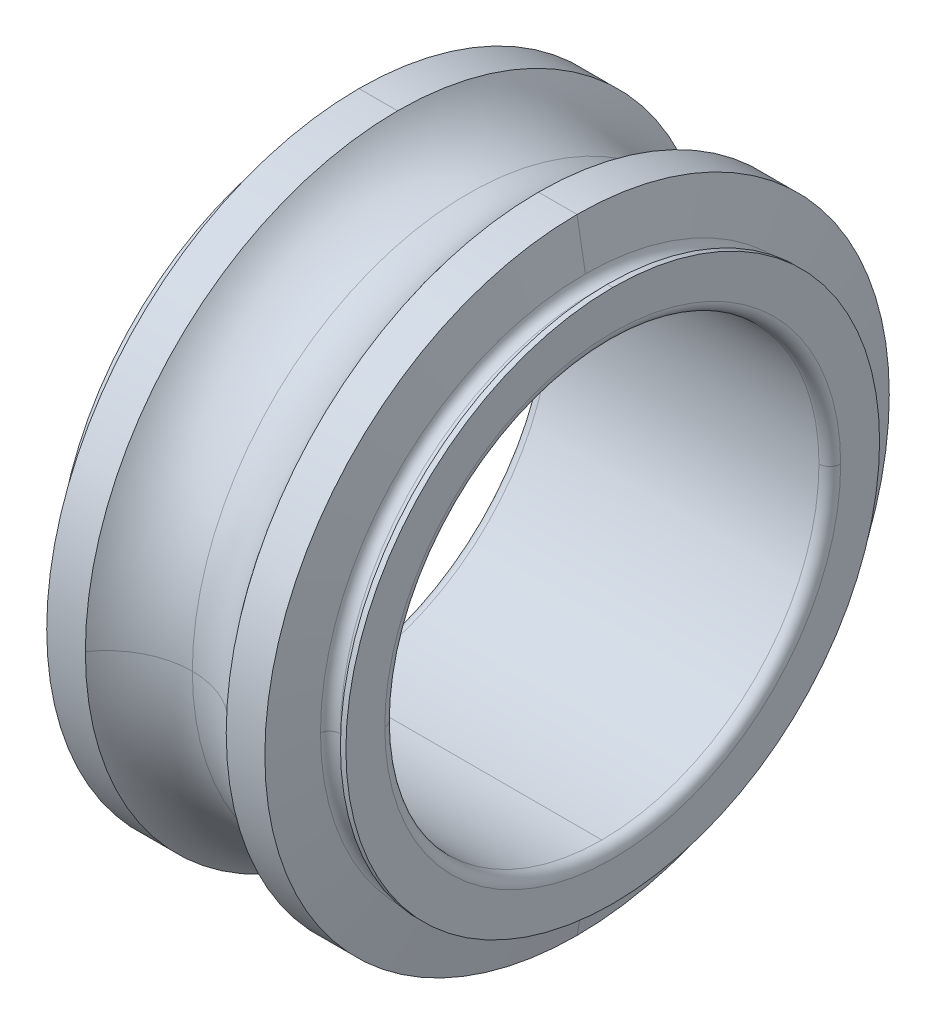
ISO-10303-21;
HEADER;
FILE_DESCRIPTION(('STEP AP214'),'2;1');
FILE_NAME('part.step','',(''),(''),'','','');
FILE_SCHEMA(('AUTOMOTIVE_DESIGN { 1 0 10303 214 1 1 1 1 }'));
ENDSEC;
DATA;
#1=APPLICATION_CONTEXT('core data for automotive mechanical design processes');
#2=APPLICATION_PROTOCOL_DEFINITION('international standard','automotive_design',2000,#1);
#3=PRODUCT_CONTEXT('',#1,'mechanical');
#4=PRODUCT('Part','Part','',(#3));
#5=PRODUCT_RELATED_PRODUCT_CATEGORY('part','',(#4));
#6=PRODUCT_DEFINITION_FORMATION('','',#4);
#7=PRODUCT_DEFINITION_CONTEXT('part definition',#1,'design');
#8=PRODUCT_DEFINITION('design','',#6,#7);
#9=PRODUCT_DEFINITION_SHAPE('','',#8);
#10=(LENGTH_UNIT() NAMED_UNIT(*) SI_UNIT(.MILLI.,.METRE.));
#11=(NAMED_UNIT(*) PLANE_ANGLE_UNIT() SI_UNIT($,.RADIAN.));
#12=(NAMED_UNIT(*) SI_UNIT($,.STERADIAN.) SOLID_ANGLE_UNIT());
#13=UNCERTAINTY_MEASURE_WITH_UNIT(LENGTH_MEASURE(1.E-05),#10,'distance_accuracy_value','');
#14=(GEOMETRIC_REPRESENTATION_CONTEXT(3) GLOBAL_UNCERTAINTY_ASSIGNED_CONTEXT((#13)) GLOBAL_UNIT_ASSIGNED_CONTEXT((#10,
#11,#12)) REPRESENTATION_CONTEXT('',''));
#15=CARTESIAN_POINT('',(0.,0.,0.));
#16=DIRECTION('',(0.,0.,1.));
#17=DIRECTION('',(1.,0.,0.));
#18=AXIS2_PLACEMENT_3D('',#15,#16,#17);
#19=CARTESIAN_POINT('',(6.48036660683857,0.,0.));
#20=DIRECTION('',(1.,0.,0.));
#21=DIRECTION('',(0.,1.,0.));
#22=AXIS2_PLACEMENT_3D('',#19,#20,#21);
#23=CYLINDRICAL_SURFACE('',#22,8.62875);
#24=DIRECTION('',(1.,0.,0.));
#25=VECTOR('',#24,1.);
#26=CARTESIAN_POINT('',(6.48036660683857,8.62875,0.));
#27=LINE('',#26,#25);
#28=CARTESIAN_POINT('',(5.94649285575365,8.62875,0.));
#29=VERTEX_POINT('',#28);
#30=CARTESIAN_POINT('',(7.0142403579235,8.62875,0.));
#31=VERTEX_POINT('',#30);
#32=EDGE_CURVE('E318',#29,#31,#27,.T.);
#33=ORIENTED_EDGE('',*,*,#32,.T.);
#34=CARTESIAN_POINT('',(7.0142403579235,0.,0.));
#35=DIRECTION('',(1.,0.,0.));
#36=DIRECTION('',(0.,1.,0.));
#37=AXIS2_PLACEMENT_3D('',#34,#35,#36);
#38=CIRCLE('',#37,8.62875);
#39=CARTESIAN_POINT('',(7.0142403579235,-8.62875,0.));
#40=VERTEX_POINT('',#39);
#41=EDGE_CURVE('E281',#40,#31,#38,.T.);
#42=ORIENTED_EDGE('',*,*,#41,.F.);
#43=DIRECTION('',(-1.,0.,0.));
#44=VECTOR('',#43,1.);
#45=CARTESIAN_POINT('',(6.48036660683857,-8.62875,0.));
#46=LINE('',#45,#44);
#47=CARTESIAN_POINT('',(5.94649285575364,-8.62875,0.));
#48=VERTEX_POINT('',#47);
#49=EDGE_CURVE('E322',#40,#48,#46,.T.);
#50=ORIENTED_EDGE('',*,*,#49,.T.);
#51=CARTESIAN_POINT('',(5.94649285575365,0.,0.));
#52=DIRECTION('',(1.,0.,0.));
#53=DIRECTION('',(0.,1.,0.));
#54=AXIS2_PLACEMENT_3D('',#51,#52,#53);
#55=CIRCLE('',#54,8.62875);
#56=CARTESIAN_POINT('',(5.94649285575364,0.,-8.62875));
#57=VERTEX_POINT('',#56);
#58=EDGE_CURVE('E205',#48,#57,#55,.T.);
#59=ORIENTED_EDGE('',*,*,#58,.T.);
#60=CARTESIAN_POINT('',(5.94649285575365,0.,0.));
#61=DIRECTION('',(1.,0.,0.));
#62=DIRECTION('',(0.,1.,0.));
#63=AXIS2_PLACEMENT_3D('',#60,#61,#62);
#64=CIRCLE('',#63,8.62875);
#65=EDGE_CURVE('E243',#57,#29,#64,.T.);
#66=ORIENTED_EDGE('',*,*,#65,.T.);
#67=EDGE_LOOP('',(#33,#42,#50,#59,#66));
#68=FACE_BOUND('',#67,.T.);
#69=ADVANCED_FACE('F17',(#68),#23,.T.);
#70=CARTESIAN_POINT('',(4.,0.,0.));
#71=DIRECTION('',(1.,0.,0.));
#72=DIRECTION('',(0.,0.,-1.));
#73=AXIS2_PLACEMENT_3D('',#70,#71,#72);
#74=TOROIDAL_SURFACE('',#73,10.,2.381);
#75=CARTESIAN_POINT('',(4.,0.,0.));
#76=DIRECTION('',(-1.,0.,0.));
#77=DIRECTION('',(0.,0.,1.));
#78=AXIS2_PLACEMENT_3D('',#75,#76,#77);
#79=CIRCLE('',#78,7.619);
#80=CARTESIAN_POINT('',(4.,0.,7.619));
#81=VERTEX_POINT('',#80);
#82=CARTESIAN_POINT('',(4.,0.,-7.619));
#83=VERTEX_POINT('',#82);
#84=EDGE_CURVE('E187',#81,#83,#79,.T.);
#85=ORIENTED_EDGE('',*,*,#84,.T.);
#86=CARTESIAN_POINT('',(4.,0.,-10.));
#87=DIRECTION('',(0.,-1.,0.));
#88=DIRECTION('',(0.,0.,-1.));
#89=AXIS2_PLACEMENT_3D('',#86,#87,#88);
#90=CIRCLE('',#89,2.381);
#91=CARTESIAN_POINT('',(2.05350714424635,0.,-8.62875));
#92=VERTEX_POINT('',#91);
#93=EDGE_CURVE('E201',#83,#92,#90,.T.);
#94=ORIENTED_EDGE('',*,*,#93,.T.);
#95=CARTESIAN_POINT('',(2.05350714424635,0.,0.));
#96=DIRECTION('',(1.,0.,0.));
#97=DIRECTION('',(0.,1.,0.));
#98=AXIS2_PLACEMENT_3D('',#95,#96,#97);
#99=CIRCLE('',#98,8.62875);
#100=CARTESIAN_POINT('',(2.05350714424635,8.62875,0.));
#101=VERTEX_POINT('',#100);
#102=EDGE_CURVE('E11',#92,#101,#99,.T.);
#103=ORIENTED_EDGE('',*,*,#102,.T.);
#104=CARTESIAN_POINT('',(2.05350714424635,0.,0.));
#105=DIRECTION('',(1.,0.,0.));
#106=DIRECTION('',(0.,1.,0.));
#107=AXIS2_PLACEMENT_3D('',#104,#105,#106);
#108=CIRCLE('',#107,8.62875);
#109=CARTESIAN_POINT('',(2.05350714424635,0.,8.62875));
#110=VERTEX_POINT('',#109);
#111=EDGE_CURVE('E189',#101,#110,#108,.T.);
#112=ORIENTED_EDGE('',*,*,#111,.T.);
#113=CARTESIAN_POINT('',(4.,0.,10.));
#114=DIRECTION('',(0.,-1.,0.));
#115=DIRECTION('',(0.,0.,1.));
#116=AXIS2_PLACEMENT_3D('',#113,#114,#115);
#117=CIRCLE('',#116,2.381);
#118=EDGE_CURVE('E182',#110,#81,#117,.T.);
#119=ORIENTED_EDGE('',*,*,#118,.T.);
#120=EDGE_LOOP('',(#85,#94,#103,#112,#119));
#121=FACE_BOUND('',#120,.T.);
#122=ADVANCED_FACE('F184',(#121),#74,.F.);
#123=CARTESIAN_POINT('',(1.51963339316143,0.,0.));
#124=DIRECTION('',(1.,0.,0.));
#125=DIRECTION('',(0.,1.,0.));
#126=AXIS2_PLACEMENT_3D('',#123,#124,#125);
#127=CYLINDRICAL_SURFACE('',#126,8.62875);
#128=DIRECTION('',(1.,0.,0.));
#129=VECTOR('',#128,1.);
#130=CARTESIAN_POINT('',(1.51963339316143,8.62875,0.));
#131=LINE('',#130,#129);
#132=CARTESIAN_POINT('',(0.985759642076504,8.62875,0.));
#133=VERTEX_POINT('',#132);
#134=EDGE_CURVE('E241',#133,#101,#131,.T.);
#135=ORIENTED_EDGE('',*,*,#134,.T.);
#136=ORIENTED_EDGE('',*,*,#102,.F.);
#137=CARTESIAN_POINT('',(2.05350714424635,0.,0.));
#138=DIRECTION('',(1.,0.,0.));
#139=DIRECTION('',(0.,1.,0.));
#140=AXIS2_PLACEMENT_3D('',#137,#138,#139);
#141=CIRCLE('',#140,8.62875);
#142=CARTESIAN_POINT('',(2.05350714424635,-8.62875,0.));
#143=VERTEX_POINT('',#142);
#144=EDGE_CURVE('E333',#143,#92,#141,.T.);
#145=ORIENTED_EDGE('',*,*,#144,.F.);
#146=DIRECTION('',(-1.,0.,0.));
#147=VECTOR('',#146,1.);
#148=CARTESIAN_POINT('',(1.51963339316143,-8.62875,0.));
#149=LINE('',#148,#147);
#150=CARTESIAN_POINT('',(0.985759642076505,-8.62875,0.));
#151=VERTEX_POINT('',#150);
#152=EDGE_CURVE('E240',#143,#151,#149,.T.);
#153=ORIENTED_EDGE('',*,*,#152,.T.);
#154=CARTESIAN_POINT('',(0.985759642076505,0.,0.));
#155=DIRECTION('',(1.,0.,0.));
#156=DIRECTION('',(0.,1.,0.));
#157=AXIS2_PLACEMENT_3D('',#154,#155,#156);
#158=CIRCLE('',#157,8.62875);
#159=EDGE_CURVE('E20',#151,#133,#158,.T.);
#160=ORIENTED_EDGE('',*,*,#159,.T.);
#161=EDGE_LOOP('',(#135,#136,#145,#153,#160));
#162=FACE_BOUND('',#161,.T.);
#163=ADVANCED_FACE('F407',(#162),#127,.T.);
#164=CARTESIAN_POINT('',(0.870570599496108,0.,0.));
#165=DIRECTION('',(1.,0.,0.));
#166=DIRECTION('',(0.,1.,0.));
#167=AXIS2_PLACEMENT_3D('',#164,#165,#166);
#168=CONICAL_SURFACE('',#167,7.97548047699463,1.39626340159546);
#169=DIRECTION('',(0.17364817766693,0.984807753012208,0.));
#170=VECTOR('',#169,1.);
#171=CARTESIAN_POINT('',(0.870570599496108,7.97548047699463,0.));
#172=LINE('',#171,#170);
#173=CARTESIAN_POINT('',(0.755381556915711,7.32221095398925,0.));
#174=VERTEX_POINT('',#173);
#175=EDGE_CURVE('E339',#174,#133,#172,.T.);
#176=ORIENTED_EDGE('',*,*,#175,.T.);
#177=ORIENTED_EDGE('',*,*,#159,.F.);
#178=DIRECTION('',(-0.17364817766693,0.984807753012208,0.));
#179=VECTOR('',#178,1.);
#180=CARTESIAN_POINT('',(0.870570599496108,-7.97548047699463,0.));
#181=LINE('',#180,#179);
#182=CARTESIAN_POINT('',(0.755381556915711,-7.32221095398925,0.));
#183=VERTEX_POINT('',#182);
#184=EDGE_CURVE('E342',#151,#183,#181,.T.);
#185=ORIENTED_EDGE('',*,*,#184,.T.);
#186=CARTESIAN_POINT('',(0.755381556915711,0.,0.));
#187=DIRECTION('',(1.,0.,0.));
#188=DIRECTION('',(0.,1.,0.));
#189=AXIS2_PLACEMENT_3D('',#186,#187,#188);
#190=CIRCLE('',#189,7.32221095398925);
#191=CARTESIAN_POINT('',(0.755381556915711,0.,-7.32221095398925));
#192=VERTEX_POINT('',#191);
#193=EDGE_CURVE('E295',#183,#192,#190,.T.);
#194=ORIENTED_EDGE('',*,*,#193,.T.);
#195=CARTESIAN_POINT('',(0.755381556915711,0.,0.));
#196=DIRECTION('',(1.,0.,0.));
#197=DIRECTION('',(0.,1.,0.));
#198=AXIS2_PLACEMENT_3D('',#195,#196,#197);
#199=CIRCLE('',#198,7.32221095398925);
#200=EDGE_CURVE('E267',#192,#174,#199,.T.);
#201=ORIENTED_EDGE('',*,*,#200,.T.);
#202=EDGE_LOOP('',(#176,#177,#185,#194,#201));
#203=FACE_BOUND('',#202,.T.);
#204=ADVANCED_FACE('F413',(#203),#168,.T.);
#205=CARTESIAN_POINT('',(0.456,0.,0.));
#206=DIRECTION('',(1.,0.,0.));
#207=DIRECTION('',(0.,0.,-1.));
#208=AXIS2_PLACEMENT_3D('',#205,#206,#207);
#209=TOROIDAL_SURFACE('',#208,7.375,0.304);
#210=CARTESIAN_POINT('',(0.456,0.,0.));
#211=DIRECTION('',(-1.,0.,0.));
#212=DIRECTION('',(0.,0.,1.));
#213=AXIS2_PLACEMENT_3D('',#210,#211,#212);
#214=CIRCLE('',#213,7.071);
#215=CARTESIAN_POINT('',(0.456,0.,7.071));
#216=VERTEX_POINT('',#215);
#217=CARTESIAN_POINT('',(0.456,0.,-7.071));
#218=VERTEX_POINT('',#217);
#219=EDGE_CURVE('E258',#216,#218,#214,.T.);
#220=ORIENTED_EDGE('',*,*,#219,.T.);
#221=CARTESIAN_POINT('',(0.456,0.,-7.375));
#222=DIRECTION('',(0.,-1.,0.));
#223=DIRECTION('',(0.,0.,-1.));
#224=AXIS2_PLACEMENT_3D('',#221,#222,#223);
#225=CIRCLE('',#224,0.304);
#226=CARTESIAN_POINT('',(0.152,0.,-7.375));
#227=VERTEX_POINT('',#226);
#228=EDGE_CURVE('E352',#218,#227,#225,.T.);
#229=ORIENTED_EDGE('',*,*,#228,.T.);
#230=CARTESIAN_POINT('',(0.152,0.,0.));
#231=DIRECTION('',(1.,0.,0.));
#232=DIRECTION('',(0.,1.,0.));
#233=AXIS2_PLACEMENT_3D('',#230,#231,#232);
#234=CIRCLE('',#233,7.375);
#235=CARTESIAN_POINT('',(0.152,7.375,0.));
#236=VERTEX_POINT('',#235);
#237=EDGE_CURVE('E403',#227,#236,#234,.T.);
#238=ORIENTED_EDGE('',*,*,#237,.T.);
#239=CARTESIAN_POINT('',(0.152,0.,0.));
#240=DIRECTION('',(1.,0.,0.));
#241=DIRECTION('',(0.,1.,0.));
#242=AXIS2_PLACEMENT_3D('',#239,#240,#241);
#243=CIRCLE('',#242,7.375);
#244=CARTESIAN_POINT('',(0.152,0.,7.375));
#245=VERTEX_POINT('',#244);
#246=EDGE_CURVE('E364',#236,#245,#243,.T.);
#247=ORIENTED_EDGE('',*,*,#246,.T.);
#248=CARTESIAN_POINT('',(0.456,0.,7.375));
#249=DIRECTION('',(0.,-1.,0.));
#250=DIRECTION('',(0.,0.,1.));
#251=AXIS2_PLACEMENT_3D('',#248,#249,#250);
#252=CIRCLE('',#251,0.304);
#253=EDGE_CURVE('E344',#245,#216,#252,.T.);
#254=ORIENTED_EDGE('',*,*,#253,.T.);
#255=EDGE_LOOP('',(#220,#229,#238,#247,#254));
#256=FACE_BOUND('',#255,.T.);
#257=ADVANCED_FACE('F498',(#256),#209,.F.);
#258=CARTESIAN_POINT('',(0.076,0.,0.));
#259=DIRECTION('',(1.,0.,0.));
#260=DIRECTION('',(0.,1.,0.));
#261=AXIS2_PLACEMENT_3D('',#258,#259,#260);
#262=CYLINDRICAL_SURFACE('',#261,7.375);
#263=DIRECTION('',(1.,0.,0.));
#264=VECTOR('',#263,1.);
#265=CARTESIAN_POINT('',(0.076,7.375,0.));
#266=LINE('',#265,#264);
#267=CARTESIAN_POINT('',(0.,7.375,0.));
#268=VERTEX_POINT('',#267);
#269=EDGE_CURVE('E355',#268,#236,#266,.T.);
#270=ORIENTED_EDGE('',*,*,#269,.T.);
#271=ORIENTED_EDGE('',*,*,#237,.F.);
#272=CARTESIAN_POINT('',(0.152,0.,0.));
#273=DIRECTION('',(1.,0.,0.));
#274=DIRECTION('',(0.,1.,0.));
#275=AXIS2_PLACEMENT_3D('',#272,#273,#274);
#276=CIRCLE('',#275,7.375);
#277=CARTESIAN_POINT('',(0.152,-7.375,0.));
#278=VERTEX_POINT('',#277);
#279=EDGE_CURVE('E349',#278,#227,#276,.T.);
#280=ORIENTED_EDGE('',*,*,#279,.F.);
#281=DIRECTION('',(-1.,0.,0.));
#282=VECTOR('',#281,1.);
#283=CARTESIAN_POINT('',(0.076,-7.375,0.));
#284=LINE('',#283,#282);
#285=CARTESIAN_POINT('',(0.,-7.375,0.));
#286=VERTEX_POINT('',#285);
#287=EDGE_CURVE('E361',#278,#286,#284,.T.);
#288=ORIENTED_EDGE('',*,*,#287,.T.);
#289=CARTESIAN_POINT('',(0.,0.,0.));
#290=DIRECTION('',(1.,0.,0.));
#291=DIRECTION('',(0.,1.,0.));
#292=AXIS2_PLACEMENT_3D('',#289,#290,#291);
#293=CIRCLE('',#292,7.375);
#294=EDGE_CURVE('E300',#286,#268,#293,.T.);
#295=ORIENTED_EDGE('',*,*,#294,.T.);
#296=EDGE_LOOP('',(#270,#271,#280,#288,#295));
#297=FACE_BOUND('',#296,.T.);
#298=ADVANCED_FACE('F494',(#297),#262,.T.);
#299=CARTESIAN_POINT('',(0.,6.8375,0.));
#300=DIRECTION('',(-1.,0.,0.));
#301=DIRECTION('',(0.,0.,1.));
#302=AXIS2_PLACEMENT_3D('',#299,#300,#301);
#303=PLANE('',#302);
#304=CARTESIAN_POINT('',(0.,0.,0.));
#305=DIRECTION('',(1.,0.,0.));
#306=DIRECTION('',(0.,1.,0.));
#307=AXIS2_PLACEMENT_3D('',#304,#305,#306);
#308=CIRCLE('',#307,6.3);
#309=CARTESIAN_POINT('',(0.,0.,6.3));
#310=VERTEX_POINT('',#309);
#311=CARTESIAN_POINT('',(0.,0.,-6.3));
#312=VERTEX_POINT('',#311);
#313=EDGE_CURVE('E298',#310,#312,#308,.T.);
#314=ORIENTED_EDGE('',*,*,#313,.T.);
#315=CARTESIAN_POINT('',(0.,0.,0.));
#316=DIRECTION('',(1.,0.,0.));
#317=DIRECTION('',(0.,1.,0.));
#318=AXIS2_PLACEMENT_3D('',#315,#316,#317);
#319=CIRCLE('',#318,6.3);
#320=EDGE_CURVE('E305',#312,#310,#319,.T.);
#321=ORIENTED_EDGE('',*,*,#320,.T.);
#322=EDGE_LOOP('',(#314,#321));
#323=FACE_BOUND('',#322,.T.);
#324=CARTESIAN_POINT('',(0.,0.,0.));
#325=DIRECTION('',(1.,0.,0.));
#326=DIRECTION('',(0.,1.,0.));
#327=AXIS2_PLACEMENT_3D('',#324,#325,#326);
#328=CIRCLE('',#327,7.375);
#329=EDGE_CURVE('E358',#268,#286,#328,.T.);
#330=ORIENTED_EDGE('',*,*,#329,.F.);
#331=ORIENTED_EDGE('',*,*,#294,.F.);
#332=EDGE_LOOP('',(#330,#331));
#333=FACE_BOUND('',#332,.T.);
#334=ADVANCED_FACE('F490',(#323,#333),#303,.T.);
#335=CARTESIAN_POINT('',(0.3,0.,0.));
#336=DIRECTION('',(1.,0.,0.));
#337=DIRECTION('',(0.,0.,-1.));
#338=AXIS2_PLACEMENT_3D('',#335,#336,#337);
#339=TOROIDAL_SURFACE('',#338,6.3,0.3);
#340=CARTESIAN_POINT('',(0.3,0.,-6.3));
#341=DIRECTION('',(0.,-1.,0.));
#342=DIRECTION('',(0.,0.,-1.));
#343=AXIS2_PLACEMENT_3D('',#340,#341,#342);
#344=CIRCLE('',#343,0.3);
#345=CARTESIAN_POINT('',(0.3,0.,-6.));
#346=VERTEX_POINT('',#345);
#347=EDGE_CURVE('E366',#346,#312,#344,.T.);
#348=ORIENTED_EDGE('',*,*,#347,.T.);
#349=ORIENTED_EDGE('',*,*,#313,.F.);
#350=CARTESIAN_POINT('',(0.3,0.,6.3));
#351=DIRECTION('',(0.,-1.,0.));
#352=DIRECTION('',(0.,0.,1.));
#353=AXIS2_PLACEMENT_3D('',#350,#351,#352);
#354=CIRCLE('',#353,0.3);
#355=CARTESIAN_POINT('',(0.3,0.,6.));
#356=VERTEX_POINT('',#355);
#357=EDGE_CURVE('E375',#310,#356,#354,.T.);
#358=ORIENTED_EDGE('',*,*,#357,.T.);
#359=CARTESIAN_POINT('',(0.3,0.,0.));
#360=DIRECTION('',(1.,0.,0.));
#361=DIRECTION('',(0.,1.,0.));
#362=AXIS2_PLACEMENT_3D('',#359,#360,#361);
#363=CIRCLE('',#362,6.);
#364=CARTESIAN_POINT('',(0.3,-6.,0.));
#365=VERTEX_POINT('',#364);
#366=EDGE_CURVE('E273',#356,#365,#363,.T.);
#367=ORIENTED_EDGE('',*,*,#366,.T.);
#368=CARTESIAN_POINT('',(0.3,0.,0.));
#369=DIRECTION('',(1.,0.,0.));
#370=DIRECTION('',(0.,1.,0.));
#371=AXIS2_PLACEMENT_3D('',#368,#369,#370);
#372=CIRCLE('',#371,6.);
#373=EDGE_CURVE('E304',#365,#346,#372,.T.);
#374=ORIENTED_EDGE('',*,*,#373,.T.);
#375=EDGE_LOOP('',(#348,#349,#358,#367,#374));
#376=FACE_BOUND('',#375,.T.);
#377=ADVANCED_FACE('F486',(#376),#339,.T.);
#378=CARTESIAN_POINT('',(4.,0.,0.));
#379=DIRECTION('',(1.,0.,0.));
#380=DIRECTION('',(0.,1.,0.));
#381=AXIS2_PLACEMENT_3D('',#378,#379,#380);
#382=CYLINDRICAL_SURFACE('',#381,6.);
#383=DIRECTION('',(1.,0.,0.));
#384=VECTOR('',#383,1.);
#385=CARTESIAN_POINT('',(4.,6.,0.));
#386=LINE('',#385,#384);
#387=CARTESIAN_POINT('',(0.3,6.,0.));
#388=VERTEX_POINT('',#387);
#389=CARTESIAN_POINT('',(7.7,6.,0.));
#390=VERTEX_POINT('',#389);
#391=EDGE_CURVE('E301',#388,#390,#386,.T.);
#392=ORIENTED_EDGE('',*,*,#391,.T.);
#393=CARTESIAN_POINT('',(7.7,0.,0.));
#394=DIRECTION('',(1.,0.,0.));
#395=DIRECTION('',(0.,1.,0.));
#396=AXIS2_PLACEMENT_3D('',#393,#394,#395);
#397=CIRCLE('',#396,6.);
#398=CARTESIAN_POINT('',(7.7,0.,6.));
#399=VERTEX_POINT('',#398);
#400=EDGE_CURVE('E389',#390,#399,#397,.T.);
#401=ORIENTED_EDGE('',*,*,#400,.T.);
#402=CARTESIAN_POINT('',(7.7,0.,0.));
#403=DIRECTION('',(1.,0.,0.));
#404=DIRECTION('',(0.,1.,0.));
#405=AXIS2_PLACEMENT_3D('',#402,#403,#404);
#406=CIRCLE('',#405,6.);
#407=CARTESIAN_POINT('',(7.7,-6.,0.));
#408=VERTEX_POINT('',#407);
#409=EDGE_CURVE('E271',#399,#408,#406,.T.);
#410=ORIENTED_EDGE('',*,*,#409,.T.);
#411=DIRECTION('',(-1.,0.,0.));
#412=VECTOR('',#411,1.);
#413=CARTESIAN_POINT('',(4.,-6.,0.));
#414=LINE('',#413,#412);
#415=EDGE_CURVE('E310',#408,#365,#414,.T.);
#416=ORIENTED_EDGE('',*,*,#415,.T.);
#417=ORIENTED_EDGE('',*,*,#366,.F.);
#418=CARTESIAN_POINT('',(0.3,0.,0.));
#419=DIRECTION('',(1.,0.,0.));
#420=DIRECTION('',(0.,1.,0.));
#421=AXIS2_PLACEMENT_3D('',#418,#419,#420);
#422=CIRCLE('',#421,6.);
#423=EDGE_CURVE('E372',#388,#356,#422,.T.);
#424=ORIENTED_EDGE('',*,*,#423,.F.);
#425=EDGE_LOOP('',(#392,#401,#410,#416,#417,#424));
#426=FACE_BOUND('',#425,.T.);
#427=ADVANCED_FACE('F477',(#426),#382,.F.);
#428=CARTESIAN_POINT('',(7.7,0.,0.));
#429=DIRECTION('',(1.,0.,0.));
#430=DIRECTION('',(0.,0.,-1.));
#431=AXIS2_PLACEMENT_3D('',#428,#429,#430);
#432=TOROIDAL_SURFACE('',#431,6.3,0.3);
#433=CARTESIAN_POINT('',(7.7,0.,-6.3));
#434=DIRECTION('',(0.,-1.,0.));
#435=DIRECTION('',(0.,0.,-1.));
#436=AXIS2_PLACEMENT_3D('',#433,#434,#435);
#437=CIRCLE('',#436,0.3);
#438=CARTESIAN_POINT('',(8.,0.,-6.3));
#439=VERTEX_POINT('',#438);
#440=CARTESIAN_POINT('',(7.7,0.,-6.));
#441=VERTEX_POINT('',#440);
#442=EDGE_CURVE('E323',#439,#441,#437,.T.);
#443=ORIENTED_EDGE('',*,*,#442,.T.);
#444=CARTESIAN_POINT('',(7.7,0.,0.));
#445=DIRECTION('',(1.,0.,0.));
#446=DIRECTION('',(0.,1.,0.));
#447=AXIS2_PLACEMENT_3D('',#444,#445,#446);
#448=CIRCLE('',#447,6.);
#449=EDGE_CURVE('E313',#408,#441,#448,.T.);
#450=ORIENTED_EDGE('',*,*,#449,.F.);
#451=ORIENTED_EDGE('',*,*,#409,.F.);
#452=CARTESIAN_POINT('',(7.7,0.,6.3));
#453=DIRECTION('',(0.,-1.,0.));
#454=DIRECTION('',(0.,0.,1.));
#455=AXIS2_PLACEMENT_3D('',#452,#453,#454);
#456=CIRCLE('',#455,0.3);
#457=CARTESIAN_POINT('',(8.,0.,6.3));
#458=VERTEX_POINT('',#457);
#459=EDGE_CURVE('E329',#399,#458,#456,.T.);
#460=ORIENTED_EDGE('',*,*,#459,.T.);
#461=CARTESIAN_POINT('',(8.,0.,0.));
#462=DIRECTION('',(1.,0.,0.));
#463=DIRECTION('',(0.,1.,0.));
#464=AXIS2_PLACEMENT_3D('',#461,#462,#463);
#465=CIRCLE('',#464,6.3);
#466=EDGE_CURVE('E274',#458,#439,#465,.T.);
#467=ORIENTED_EDGE('',*,*,#466,.T.);
#468=EDGE_LOOP('',(#443,#450,#451,#460,#467));
#469=FACE_BOUND('',#468,.T.);
#470=ADVANCED_FACE('F469',(#469),#432,.T.);
#471=CARTESIAN_POINT('',(8.,6.8375,0.));
#472=DIRECTION('',(1.,0.,0.));
#473=DIRECTION('',(0.,1.,0.));
#474=AXIS2_PLACEMENT_3D('',#471,#472,#473);
#475=PLANE('',#474);
#476=CARTESIAN_POINT('',(8.,0.,0.));
#477=DIRECTION('',(1.,0.,0.));
#478=DIRECTION('',(0.,1.,0.));
#479=AXIS2_PLACEMENT_3D('',#476,#477,#478);
#480=CIRCLE('',#479,6.3);
#481=EDGE_CURVE('E325',#439,#458,#480,.T.);
#482=ORIENTED_EDGE('',*,*,#481,.F.);
#483=ORIENTED_EDGE('',*,*,#466,.F.);
#484=EDGE_LOOP('',(#482,#483));
#485=FACE_BOUND('',#484,.T.);
#486=CARTESIAN_POINT('',(8.,0.,0.));
#487=DIRECTION('',(1.,0.,0.));
#488=DIRECTION('',(0.,1.,0.));
#489=AXIS2_PLACEMENT_3D('',#486,#487,#488);
#490=CIRCLE('',#489,7.375);
#491=CARTESIAN_POINT('',(8.,7.375,0.));
#492=VERTEX_POINT('',#491);
#493=CARTESIAN_POINT('',(8.,-7.375,0.));
#494=VERTEX_POINT('',#493);
#495=EDGE_CURVE('E253',#492,#494,#490,.T.);
#496=ORIENTED_EDGE('',*,*,#495,.T.);
#497=CARTESIAN_POINT('',(8.,0.,0.));
#498=DIRECTION('',(1.,0.,0.));
#499=DIRECTION('',(0.,1.,0.));
#500=AXIS2_PLACEMENT_3D('',#497,#498,#499);
#501=CIRCLE('',#500,7.375);
#502=EDGE_CURVE('E279',#494,#492,#501,.T.);
#503=ORIENTED_EDGE('',*,*,#502,.T.);
#504=EDGE_LOOP('',(#496,#503));
#505=FACE_BOUND('',#504,.T.);
#506=ADVANCED_FACE('F467',(#485,#505),#475,.T.);
#507=CARTESIAN_POINT('',(7.924,0.,0.));
#508=DIRECTION('',(1.,0.,0.));
#509=DIRECTION('',(0.,1.,0.));
#510=AXIS2_PLACEMENT_3D('',#507,#508,#509);
#511=CYLINDRICAL_SURFACE('',#510,7.375);
#512=DIRECTION('',(1.,0.,0.));
#513=VECTOR('',#512,1.);
#514=CARTESIAN_POINT('',(7.924,7.375,0.));
#515=LINE('',#514,#513);
#516=CARTESIAN_POINT('',(7.848,7.375,0.));
#517=VERTEX_POINT('',#516);
#518=EDGE_CURVE('E392',#517,#492,#515,.T.);
#519=ORIENTED_EDGE('',*,*,#518,.T.);
#520=ORIENTED_EDGE('',*,*,#502,.F.);
#521=DIRECTION('',(-1.,0.,0.));
#522=VECTOR('',#521,1.);
#523=CARTESIAN_POINT('',(7.924,-7.375,0.));
#524=LINE('',#523,#522);
#525=CARTESIAN_POINT('',(7.848,-7.375,0.));
#526=VERTEX_POINT('',#525);
#527=EDGE_CURVE('E395',#494,#526,#524,.T.);
#528=ORIENTED_EDGE('',*,*,#527,.T.);
#529=CARTESIAN_POINT('',(7.848,0.,0.));
#530=DIRECTION('',(1.,0.,0.));
#531=DIRECTION('',(0.,1.,0.));
#532=AXIS2_PLACEMENT_3D('',#529,#530,#531);
#533=CIRCLE('',#532,7.375);
#534=CARTESIAN_POINT('',(7.848,0.,-7.375));
#535=VERTEX_POINT('',#534);
#536=EDGE_CURVE('E284',#526,#535,#533,.T.);
#537=ORIENTED_EDGE('',*,*,#536,.T.);
#538=CARTESIAN_POINT('',(7.848,0.,0.));
#539=DIRECTION('',(1.,0.,0.));
#540=DIRECTION('',(0.,1.,0.));
#541=AXIS2_PLACEMENT_3D('',#538,#539,#540);
#542=CIRCLE('',#541,7.375);
#543=EDGE_CURVE('E226',#535,#517,#542,.T.);
#544=ORIENTED_EDGE('',*,*,#543,.T.);
#545=EDGE_LOOP('',(#519,#520,#528,#537,#544));
#546=FACE_BOUND('',#545,.T.);
#547=ADVANCED_FACE('F465',(#546),#511,.T.);
#548=CARTESIAN_POINT('',(7.544,0.,0.));
#549=DIRECTION('',(1.,0.,0.));
#550=DIRECTION('',(0.,0.,-1.));
#551=AXIS2_PLACEMENT_3D('',#548,#549,#550);
#552=TOROIDAL_SURFACE('',#551,7.375,0.304);
#553=CARTESIAN_POINT('',(7.544,0.,0.));
#554=DIRECTION('',(-1.,0.,0.));
#555=DIRECTION('',(0.,0.,1.));
#556=AXIS2_PLACEMENT_3D('',#553,#554,#555);
#557=CIRCLE('',#556,7.071);
#558=CARTESIAN_POINT('',(7.544,0.,7.071));
#559=VERTEX_POINT('',#558);
#560=CARTESIAN_POINT('',(7.544,0.,-7.071));
#561=VERTEX_POINT('',#560);
#562=EDGE_CURVE('E256',#559,#561,#557,.T.);
#563=ORIENTED_EDGE('',*,*,#562,.T.);
#564=CARTESIAN_POINT('',(7.544,0.,-7.375));
#565=DIRECTION('',(0.,-1.,0.));
#566=DIRECTION('',(0.,0.,-1.));
#567=AXIS2_PLACEMENT_3D('',#564,#565,#566);
#568=CIRCLE('',#567,0.304);
#569=CARTESIAN_POINT('',(7.24461844308429,0.,-7.32221095398925));
#570=VERTEX_POINT('',#569);
#571=EDGE_CURVE('E232',#561,#570,#568,.T.);
#572=ORIENTED_EDGE('',*,*,#571,.T.);
#573=CARTESIAN_POINT('',(7.24461844308429,0.,0.));
#574=DIRECTION('',(1.,0.,0.));
#575=DIRECTION('',(0.,1.,0.));
#576=AXIS2_PLACEMENT_3D('',#573,#574,#575);
#577=CIRCLE('',#576,7.32221095398925);
#578=CARTESIAN_POINT('',(7.24461844308429,7.32221095398925,0.));
#579=VERTEX_POINT('',#578);
#580=EDGE_CURVE('E32',#570,#579,#577,.T.);
#581=ORIENTED_EDGE('',*,*,#580,.T.);
#582=CARTESIAN_POINT('',(7.24461844308429,0.,0.));
#583=DIRECTION('',(1.,0.,0.));
#584=DIRECTION('',(0.,1.,0.));
#585=AXIS2_PLACEMENT_3D('',#582,#583,#584);
#586=CIRCLE('',#585,7.32221095398925);
#587=CARTESIAN_POINT('',(7.24461844308429,0.,7.32221095398925));
#588=VERTEX_POINT('',#587);
#589=EDGE_CURVE('E287',#579,#588,#586,.T.);
#590=ORIENTED_EDGE('',*,*,#589,.T.);
#591=CARTESIAN_POINT('',(7.544,0.,7.375));
#592=DIRECTION('',(0.,-1.,0.));
#593=DIRECTION('',(0.,0.,1.));
#594=AXIS2_PLACEMENT_3D('',#591,#592,#593);
#595=CIRCLE('',#594,0.304);
#596=EDGE_CURVE('E251',#588,#559,#595,.T.);
#597=ORIENTED_EDGE('',*,*,#596,.T.);
#598=EDGE_LOOP('',(#563,#572,#581,#590,#597));
#599=FACE_BOUND('',#598,.T.);
#600=ADVANCED_FACE('F450',(#599),#552,.F.);
#601=CARTESIAN_POINT('',(7.12942940050389,0.,0.));
#602=DIRECTION('',(-1.,0.,0.));
#603=DIRECTION('',(0.,1.,0.));
#604=AXIS2_PLACEMENT_3D('',#601,#602,#603);
#605=CONICAL_SURFACE('',#604,7.97548047699463,1.39626340159546);
#606=DIRECTION('',(0.17364817766693,-0.984807753012208,0.));
#607=VECTOR('',#606,1.);
#608=CARTESIAN_POINT('',(7.12942940050389,7.97548047699463,0.));
#609=LINE('',#608,#607);
#610=EDGE_CURVE('E378',#31,#579,#609,.T.);
#611=ORIENTED_EDGE('',*,*,#610,.T.);
#612=ORIENTED_EDGE('',*,*,#580,.F.);
#613=CARTESIAN_POINT('',(7.24461844308429,0.,0.));
#614=DIRECTION('',(1.,0.,0.));
#615=DIRECTION('',(0.,1.,0.));
#616=AXIS2_PLACEMENT_3D('',#613,#614,#615);
#617=CIRCLE('',#616,7.32221095398925);
#618=CARTESIAN_POINT('',(7.24461844308429,-7.32221095398925,0.));
#619=VERTEX_POINT('',#618);
#620=EDGE_CURVE('E229',#619,#570,#617,.T.);
#621=ORIENTED_EDGE('',*,*,#620,.F.);
#622=DIRECTION('',(-0.17364817766693,-0.984807753012208,0.));
#623=VECTOR('',#622,1.);
#624=CARTESIAN_POINT('',(7.12942940050389,-7.97548047699463,0.));
#625=LINE('',#624,#623);
#626=EDGE_CURVE('E289',#619,#40,#625,.T.);
#627=ORIENTED_EDGE('',*,*,#626,.T.);
#628=ORIENTED_EDGE('',*,*,#41,.T.);
#629=EDGE_LOOP('',(#611,#612,#621,#627,#628));
#630=FACE_BOUND('',#629,.T.);
#631=ADVANCED_FACE('F444',(#630),#605,.T.);
#632=CARTESIAN_POINT('',(7.12942940050389,0.,0.));
#633=DIRECTION('',(-1.,0.,0.));
#634=DIRECTION('',(0.,1.,0.));
#635=AXIS2_PLACEMENT_3D('',#632,#633,#634);
#636=CONICAL_SURFACE('',#635,7.97548047699463,1.39626340159546);
#637=ORIENTED_EDGE('',*,*,#610,.F.);
#638=CARTESIAN_POINT('',(7.0142403579235,0.,0.));
#639=DIRECTION('',(1.,0.,0.));
#640=DIRECTION('',(0.,1.,0.));
#641=AXIS2_PLACEMENT_3D('',#638,#639,#640);
#642=CIRCLE('',#641,8.62875);
#643=EDGE_CURVE('E194',#31,#40,#642,.T.);
#644=ORIENTED_EDGE('',*,*,#643,.T.);
#645=ORIENTED_EDGE('',*,*,#626,.F.);
#646=CARTESIAN_POINT('',(7.24461844308429,0.,0.));
#647=DIRECTION('',(1.,0.,0.));
#648=DIRECTION('',(0.,1.,0.));
#649=AXIS2_PLACEMENT_3D('',#646,#647,#648);
#650=CIRCLE('',#649,7.32221095398925);
#651=EDGE_CURVE('E233',#588,#619,#650,.T.);
#652=ORIENTED_EDGE('',*,*,#651,.F.);
#653=ORIENTED_EDGE('',*,*,#589,.F.);
#654=EDGE_LOOP('',(#637,#644,#645,#652,#653));
#655=FACE_BOUND('',#654,.T.);
#656=ADVANCED_FACE('F442',(#655),#636,.T.);
#657=CARTESIAN_POINT('',(7.544,0.,0.));
#658=DIRECTION('',(1.,0.,0.));
#659=DIRECTION('',(0.,0.,-1.));
#660=AXIS2_PLACEMENT_3D('',#657,#658,#659);
#661=TOROIDAL_SURFACE('',#660,7.375,0.304);
#662=CARTESIAN_POINT('',(7.544,0.,0.));
#663=DIRECTION('',(-1.,0.,0.));
#664=DIRECTION('',(0.,0.,1.));
#665=AXIS2_PLACEMENT_3D('',#662,#663,#664);
#666=CIRCLE('',#665,7.071);
#667=EDGE_CURVE('E246',#561,#559,#666,.T.);
#668=ORIENTED_EDGE('',*,*,#667,.T.);
#669=ORIENTED_EDGE('',*,*,#596,.F.);
#670=ORIENTED_EDGE('',*,*,#651,.T.);
#671=ORIENTED_EDGE('',*,*,#620,.T.);
#672=ORIENTED_EDGE('',*,*,#571,.F.);
#673=EDGE_LOOP('',(#668,#669,#670,#671,#672));
#674=FACE_BOUND('',#673,.T.);
#675=ADVANCED_FACE('F447',(#674),#661,.F.);
#676=CARTESIAN_POINT('',(7.924,0.,0.));
#677=DIRECTION('',(1.,0.,0.));
#678=DIRECTION('',(0.,1.,0.));
#679=AXIS2_PLACEMENT_3D('',#676,#677,#678);
#680=CYLINDRICAL_SURFACE('',#679,7.375);
#681=ORIENTED_EDGE('',*,*,#518,.F.);
#682=CARTESIAN_POINT('',(7.848,0.,0.));
#683=DIRECTION('',(1.,0.,0.));
#684=DIRECTION('',(0.,1.,0.));
#685=AXIS2_PLACEMENT_3D('',#682,#683,#684);
#686=CIRCLE('',#685,7.375);
#687=CARTESIAN_POINT('',(7.848,0.,7.375));
#688=VERTEX_POINT('',#687);
#689=EDGE_CURVE('E224',#517,#688,#686,.T.);
#690=ORIENTED_EDGE('',*,*,#689,.T.);
#691=CARTESIAN_POINT('',(7.848,0.,0.));
#692=DIRECTION('',(1.,0.,0.));
#693=DIRECTION('',(0.,1.,0.));
#694=AXIS2_PLACEMENT_3D('',#691,#692,#693);
#695=CIRCLE('',#694,7.375);
#696=EDGE_CURVE('E286',#688,#526,#695,.T.);
#697=ORIENTED_EDGE('',*,*,#696,.T.);
#698=ORIENTED_EDGE('',*,*,#527,.F.);
#699=ORIENTED_EDGE('',*,*,#495,.F.);
#700=EDGE_LOOP('',(#681,#690,#697,#698,#699));
#701=FACE_BOUND('',#700,.T.);
#702=ADVANCED_FACE('F462',(#701),#680,.T.);
#703=CARTESIAN_POINT('',(7.7,0.,0.));
#704=DIRECTION('',(1.,0.,0.));
#705=DIRECTION('',(0.,0.,-1.));
#706=AXIS2_PLACEMENT_3D('',#703,#704,#705);
#707=TOROIDAL_SURFACE('',#706,6.3,0.3);
#708=ORIENTED_EDGE('',*,*,#442,.F.);
#709=ORIENTED_EDGE('',*,*,#481,.T.);
#710=ORIENTED_EDGE('',*,*,#459,.F.);
#711=ORIENTED_EDGE('',*,*,#400,.F.);
#712=CARTESIAN_POINT('',(7.7,0.,0.));
#713=DIRECTION('',(1.,0.,0.));
#714=DIRECTION('',(0.,1.,0.));
#715=AXIS2_PLACEMENT_3D('',#712,#713,#714);
#716=CIRCLE('',#715,6.);
#717=EDGE_CURVE('E317',#441,#390,#716,.T.);
#718=ORIENTED_EDGE('',*,*,#717,.F.);
#719=EDGE_LOOP('',(#708,#709,#710,#711,#718));
#720=FACE_BOUND('',#719,.T.);
#721=ADVANCED_FACE('F591',(#720),#707,.T.);
#722=CARTESIAN_POINT('',(4.,0.,0.));
#723=DIRECTION('',(1.,0.,0.));
#724=DIRECTION('',(0.,1.,0.));
#725=AXIS2_PLACEMENT_3D('',#722,#723,#724);
#726=CYLINDRICAL_SURFACE('',#725,6.);
#727=ORIENTED_EDGE('',*,*,#391,.F.);
#728=CARTESIAN_POINT('',(0.3,0.,0.));
#729=DIRECTION('',(1.,0.,0.));
#730=DIRECTION('',(0.,1.,0.));
#731=AXIS2_PLACEMENT_3D('',#728,#729,#730);
#732=CIRCLE('',#731,6.);
#733=EDGE_CURVE('E369',#346,#388,#732,.T.);
#734=ORIENTED_EDGE('',*,*,#733,.F.);
#735=ORIENTED_EDGE('',*,*,#373,.F.);
#736=ORIENTED_EDGE('',*,*,#415,.F.);
#737=ORIENTED_EDGE('',*,*,#449,.T.);
#738=ORIENTED_EDGE('',*,*,#717,.T.);
#739=EDGE_LOOP('',(#727,#734,#735,#736,#737,#738));
#740=FACE_BOUND('',#739,.T.);
#741=ADVANCED_FACE('F600',(#740),#726,.F.);
#742=CARTESIAN_POINT('',(0.3,0.,0.));
#743=DIRECTION('',(1.,0.,0.));
#744=DIRECTION('',(0.,0.,-1.));
#745=AXIS2_PLACEMENT_3D('',#742,#743,#744);
#746=TOROIDAL_SURFACE('',#745,6.3,0.3);
#747=ORIENTED_EDGE('',*,*,#347,.F.);
#748=ORIENTED_EDGE('',*,*,#733,.T.);
#749=ORIENTED_EDGE('',*,*,#423,.T.);
#750=ORIENTED_EDGE('',*,*,#357,.F.);
#751=ORIENTED_EDGE('',*,*,#320,.F.);
#752=EDGE_LOOP('',(#747,#748,#749,#750,#751));
#753=FACE_BOUND('',#752,.T.);
#754=ADVANCED_FACE('F610',(#753),#746,.T.);
#755=CARTESIAN_POINT('',(0.076,0.,0.));
#756=DIRECTION('',(1.,0.,0.));
#757=DIRECTION('',(0.,1.,0.));
#758=AXIS2_PLACEMENT_3D('',#755,#756,#757);
#759=CYLINDRICAL_SURFACE('',#758,7.375);
#760=ORIENTED_EDGE('',*,*,#269,.F.);
#761=ORIENTED_EDGE('',*,*,#329,.T.);
#762=ORIENTED_EDGE('',*,*,#287,.F.);
#763=CARTESIAN_POINT('',(0.152,0.,0.));
#764=DIRECTION('',(1.,0.,0.));
#765=DIRECTION('',(0.,1.,0.));
#766=AXIS2_PLACEMENT_3D('',#763,#764,#765);
#767=CIRCLE('',#766,7.375);
#768=EDGE_CURVE('E346',#245,#278,#767,.T.);
#769=ORIENTED_EDGE('',*,*,#768,.F.);
#770=ORIENTED_EDGE('',*,*,#246,.F.);
#771=EDGE_LOOP('',(#760,#761,#762,#769,#770));
#772=FACE_BOUND('',#771,.T.);
#773=ADVANCED_FACE('F619',(#772),#759,.T.);
#774=CARTESIAN_POINT('',(0.456,0.,0.));
#775=DIRECTION('',(1.,0.,0.));
#776=DIRECTION('',(0.,0.,-1.));
#777=AXIS2_PLACEMENT_3D('',#774,#775,#776);
#778=TOROIDAL_SURFACE('',#777,7.375,0.304);
#779=CARTESIAN_POINT('',(0.456,0.,0.));
#780=DIRECTION('',(-1.,0.,0.));
#781=DIRECTION('',(0.,0.,1.));
#782=AXIS2_PLACEMENT_3D('',#779,#780,#781);
#783=CIRCLE('',#782,7.071);
#784=EDGE_CURVE('E292',#218,#216,#783,.T.);
#785=ORIENTED_EDGE('',*,*,#784,.T.);
#786=ORIENTED_EDGE('',*,*,#253,.F.);
#787=ORIENTED_EDGE('',*,*,#768,.T.);
#788=ORIENTED_EDGE('',*,*,#279,.T.);
#789=ORIENTED_EDGE('',*,*,#228,.F.);
#790=EDGE_LOOP('',(#785,#786,#787,#788,#789));
#791=FACE_BOUND('',#790,.T.);
#792=ADVANCED_FACE('F429',(#791),#778,.F.);
#793=CARTESIAN_POINT('',(0.870570599496108,0.,0.));
#794=DIRECTION('',(1.,0.,0.));
#795=DIRECTION('',(0.,1.,0.));
#796=AXIS2_PLACEMENT_3D('',#793,#794,#795);
#797=CONICAL_SURFACE('',#796,7.97548047699463,1.39626340159546);
#798=ORIENTED_EDGE('',*,*,#175,.F.);
#799=CARTESIAN_POINT('',(0.755381556915711,0.,0.));
#800=DIRECTION('',(1.,0.,0.));
#801=DIRECTION('',(0.,1.,0.));
#802=AXIS2_PLACEMENT_3D('',#799,#800,#801);
#803=CIRCLE('',#802,7.32221095398925);
#804=CARTESIAN_POINT('',(0.755381556915711,0.,7.32221095398925));
#805=VERTEX_POINT('',#804);
#806=EDGE_CURVE('E264',#174,#805,#803,.T.);
#807=ORIENTED_EDGE('',*,*,#806,.T.);
#808=CARTESIAN_POINT('',(0.755381556915711,0.,0.));
#809=DIRECTION('',(1.,0.,0.));
#810=DIRECTION('',(0.,1.,0.));
#811=AXIS2_PLACEMENT_3D('',#808,#809,#810);
#812=CIRCLE('',#811,7.32221095398925);
#813=EDGE_CURVE('E206',#805,#183,#812,.T.);
#814=ORIENTED_EDGE('',*,*,#813,.T.);
#815=ORIENTED_EDGE('',*,*,#184,.F.);
#816=CARTESIAN_POINT('',(0.985759642076505,0.,0.));
#817=DIRECTION('',(1.,0.,0.));
#818=DIRECTION('',(0.,1.,0.));
#819=AXIS2_PLACEMENT_3D('',#816,#817,#818);
#820=CIRCLE('',#819,8.62875);
#821=EDGE_CURVE('E237',#133,#151,#820,.T.);
#822=ORIENTED_EDGE('',*,*,#821,.F.);
#823=EDGE_LOOP('',(#798,#807,#814,#815,#822));
#824=FACE_BOUND('',#823,.T.);
#825=ADVANCED_FACE('F417',(#824),#797,.T.);
#826=CARTESIAN_POINT('',(1.51963339316143,0.,0.));
#827=DIRECTION('',(1.,0.,0.));
#828=DIRECTION('',(0.,1.,0.));
#829=AXIS2_PLACEMENT_3D('',#826,#827,#828);
#830=CYLINDRICAL_SURFACE('',#829,8.62875);
#831=ORIENTED_EDGE('',*,*,#134,.F.);
#832=ORIENTED_EDGE('',*,*,#821,.T.);
#833=ORIENTED_EDGE('',*,*,#152,.F.);
#834=CARTESIAN_POINT('',(2.05350714424635,0.,0.));
#835=DIRECTION('',(1.,0.,0.));
#836=DIRECTION('',(0.,1.,0.));
#837=AXIS2_PLACEMENT_3D('',#834,#835,#836);
#838=CIRCLE('',#837,8.62875);
#839=EDGE_CURVE('E193',#110,#143,#838,.T.);
#840=ORIENTED_EDGE('',*,*,#839,.F.);
#841=ORIENTED_EDGE('',*,*,#111,.F.);
#842=EDGE_LOOP('',(#831,#832,#833,#840,#841));
#843=FACE_BOUND('',#842,.T.);
#844=ADVANCED_FACE('F419',(#843),#830,.T.);
#845=CARTESIAN_POINT('',(4.,0.,0.));
#846=DIRECTION('',(1.,0.,0.));
#847=DIRECTION('',(0.,0.,-1.));
#848=AXIS2_PLACEMENT_3D('',#845,#846,#847);
#849=TOROIDAL_SURFACE('',#848,10.,2.381);
#850=CARTESIAN_POINT('',(4.,0.,0.));
#851=DIRECTION('',(-1.,0.,0.));
#852=DIRECTION('',(0.,0.,1.));
#853=AXIS2_PLACEMENT_3D('',#850,#851,#852);
#854=CIRCLE('',#853,7.619);
#855=EDGE_CURVE('E197',#83,#81,#854,.T.);
#856=ORIENTED_EDGE('',*,*,#855,.T.);
#857=ORIENTED_EDGE('',*,*,#118,.F.);
#858=ORIENTED_EDGE('',*,*,#839,.T.);
#859=ORIENTED_EDGE('',*,*,#144,.T.);
#860=ORIENTED_EDGE('',*,*,#93,.F.);
#861=EDGE_LOOP('',(#856,#857,#858,#859,#860));
#862=FACE_BOUND('',#861,.T.);
#863=ADVANCED_FACE('F199',(#862),#849,.F.);
#864=CARTESIAN_POINT('',(6.48036660683857,0.,0.));
#865=DIRECTION('',(1.,0.,0.));
#866=DIRECTION('',(0.,1.,0.));
#867=AXIS2_PLACEMENT_3D('',#864,#865,#866);
#868=CYLINDRICAL_SURFACE('',#867,8.62875);
#869=ORIENTED_EDGE('',*,*,#32,.F.);
#870=CARTESIAN_POINT('',(5.94649285575365,0.,0.));
#871=DIRECTION('',(1.,0.,0.));
#872=DIRECTION('',(0.,1.,0.));
#873=AXIS2_PLACEMENT_3D('',#870,#871,#872);
#874=CIRCLE('',#873,8.62875);
#875=CARTESIAN_POINT('',(5.94649285575364,0.,8.62875));
#876=VERTEX_POINT('',#875);
#877=EDGE_CURVE('E217',#29,#876,#874,.T.);
#878=ORIENTED_EDGE('',*,*,#877,.T.);
#879=CARTESIAN_POINT('',(5.94649285575365,0.,0.));
#880=DIRECTION('',(1.,0.,0.));
#881=DIRECTION('',(0.,1.,0.));
#882=AXIS2_PLACEMENT_3D('',#879,#880,#881);
#883=CIRCLE('',#882,8.62875);
#884=EDGE_CURVE('E213',#876,#48,#883,.T.);
#885=ORIENTED_EDGE('',*,*,#884,.T.);
#886=ORIENTED_EDGE('',*,*,#49,.F.);
#887=ORIENTED_EDGE('',*,*,#643,.F.);
#888=EDGE_LOOP('',(#869,#878,#885,#886,#887));
#889=FACE_BOUND('',#888,.T.);
#890=ADVANCED_FACE('F427',(#889),#868,.T.);
#891=CARTESIAN_POINT('',(4.,0.,0.));
#892=DIRECTION('',(1.,0.,0.));
#893=DIRECTION('',(0.,0.,-1.));
#894=AXIS2_PLACEMENT_3D('',#891,#892,#893);
#895=TOROIDAL_SURFACE('',#894,10.,2.381);
#896=ORIENTED_EDGE('',*,*,#855,.F.);
#897=CARTESIAN_POINT('',(4.,0.,-10.));
#898=DIRECTION('',(0.,-1.,0.));
#899=DIRECTION('',(0.,0.,-1.));
#900=AXIS2_PLACEMENT_3D('',#897,#898,#899);
#901=CIRCLE('',#900,2.381);
#902=EDGE_CURVE('E221',#57,#83,#901,.T.);
#903=ORIENTED_EDGE('',*,*,#902,.F.);
#904=ORIENTED_EDGE('',*,*,#58,.F.);
#905=ORIENTED_EDGE('',*,*,#884,.F.);
#906=CARTESIAN_POINT('',(4.,0.,10.));
#907=DIRECTION('',(0.,-1.,0.));
#908=DIRECTION('',(0.,0.,1.));
#909=AXIS2_PLACEMENT_3D('',#906,#907,#908);
#910=CIRCLE('',#909,2.381);
#911=EDGE_CURVE('E209',#81,#876,#910,.T.);
#912=ORIENTED_EDGE('',*,*,#911,.F.);
#913=EDGE_LOOP('',(#896,#903,#904,#905,#912));
#914=FACE_BOUND('',#913,.T.);
#915=ADVANCED_FACE('F210',(#914),#895,.F.);
#916=CARTESIAN_POINT('',(0.456,0.,0.));
#917=DIRECTION('',(1.,0.,0.));
#918=DIRECTION('',(0.,0.,-1.));
#919=AXIS2_PLACEMENT_3D('',#916,#917,#918);
#920=TOROIDAL_SURFACE('',#919,7.375,0.304);
#921=ORIENTED_EDGE('',*,*,#784,.F.);
#922=CARTESIAN_POINT('',(0.456,0.,-7.375));
#923=DIRECTION('',(0.,-1.,0.));
#924=DIRECTION('',(0.,0.,-1.));
#925=AXIS2_PLACEMENT_3D('',#922,#923,#924);
#926=CIRCLE('',#925,0.304);
#927=EDGE_CURVE('E270',#192,#218,#926,.T.);
#928=ORIENTED_EDGE('',*,*,#927,.F.);
#929=ORIENTED_EDGE('',*,*,#193,.F.);
#930=ORIENTED_EDGE('',*,*,#813,.F.);
#931=CARTESIAN_POINT('',(0.456,0.,7.375));
#932=DIRECTION('',(0.,-1.,0.));
#933=DIRECTION('',(0.,0.,1.));
#934=AXIS2_PLACEMENT_3D('',#931,#932,#933);
#935=CIRCLE('',#934,0.304);
#936=EDGE_CURVE('E261',#216,#805,#935,.T.);
#937=ORIENTED_EDGE('',*,*,#936,.F.);
#938=EDGE_LOOP('',(#921,#928,#929,#930,#937));
#939=FACE_BOUND('',#938,.T.);
#940=ADVANCED_FACE('F671',(#939),#920,.F.);
#941=CARTESIAN_POINT('',(7.544,0.,0.));
#942=DIRECTION('',(1.,0.,0.));
#943=DIRECTION('',(0.,0.,-1.));
#944=AXIS2_PLACEMENT_3D('',#941,#942,#943);
#945=TOROIDAL_SURFACE('',#944,7.375,0.304);
#946=ORIENTED_EDGE('',*,*,#667,.F.);
#947=CARTESIAN_POINT('',(7.544,0.,-7.375));
#948=DIRECTION('',(0.,-1.,0.));
#949=DIRECTION('',(0.,0.,-1.));
#950=AXIS2_PLACEMENT_3D('',#947,#948,#949);
#951=CIRCLE('',#950,0.304);
#952=EDGE_CURVE('E236',#535,#561,#951,.T.);
#953=ORIENTED_EDGE('',*,*,#952,.F.);
#954=ORIENTED_EDGE('',*,*,#536,.F.);
#955=ORIENTED_EDGE('',*,*,#696,.F.);
#956=CARTESIAN_POINT('',(7.544,0.,7.375));
#957=DIRECTION('',(0.,-1.,0.));
#958=DIRECTION('',(0.,0.,1.));
#959=AXIS2_PLACEMENT_3D('',#956,#957,#958);
#960=CIRCLE('',#959,0.304);
#961=EDGE_CURVE('E227',#559,#688,#960,.T.);
#962=ORIENTED_EDGE('',*,*,#961,.F.);
#963=EDGE_LOOP('',(#946,#953,#954,#955,#962));
#964=FACE_BOUND('',#963,.T.);
#965=ADVANCED_FACE('F459',(#964),#945,.F.);
#966=CARTESIAN_POINT('',(7.544,0.,0.));
#967=DIRECTION('',(1.,0.,0.));
#968=DIRECTION('',(0.,0.,-1.));
#969=AXIS2_PLACEMENT_3D('',#966,#967,#968);
#970=TOROIDAL_SURFACE('',#969,7.375,0.304);
#971=ORIENTED_EDGE('',*,*,#562,.F.);
#972=ORIENTED_EDGE('',*,*,#961,.T.);
#973=ORIENTED_EDGE('',*,*,#689,.F.);
#974=ORIENTED_EDGE('',*,*,#543,.F.);
#975=ORIENTED_EDGE('',*,*,#952,.T.);
#976=EDGE_LOOP('',(#971,#972,#973,#974,#975));
#977=FACE_BOUND('',#976,.T.);
#978=ADVANCED_FACE('F453',(#977),#970,.F.);
#979=CARTESIAN_POINT('',(0.456,0.,0.));
#980=DIRECTION('',(1.,0.,0.));
#981=DIRECTION('',(0.,0.,-1.));
#982=AXIS2_PLACEMENT_3D('',#979,#980,#981);
#983=TOROIDAL_SURFACE('',#982,7.375,0.304);
#984=ORIENTED_EDGE('',*,*,#219,.F.);
#985=ORIENTED_EDGE('',*,*,#936,.T.);
#986=ORIENTED_EDGE('',*,*,#806,.F.);
#987=ORIENTED_EDGE('',*,*,#200,.F.);
#988=ORIENTED_EDGE('',*,*,#927,.T.);
#989=EDGE_LOOP('',(#984,#985,#986,#987,#988));
#990=FACE_BOUND('',#989,.T.);
#991=ADVANCED_FACE('F697',(#990),#983,.F.);
#992=CARTESIAN_POINT('',(4.,0.,0.));
#993=DIRECTION('',(1.,0.,0.));
#994=DIRECTION('',(0.,0.,-1.));
#995=AXIS2_PLACEMENT_3D('',#992,#993,#994);
#996=TOROIDAL_SURFACE('',#995,10.,2.381);
#997=ORIENTED_EDGE('',*,*,#84,.F.);
#998=ORIENTED_EDGE('',*,*,#911,.T.);
#999=ORIENTED_EDGE('',*,*,#877,.F.);
#1000=ORIENTED_EDGE('',*,*,#65,.F.);
#1001=ORIENTED_EDGE('',*,*,#902,.T.);
#1002=EDGE_LOOP('',(#997,#998,#999,#1000,#1001));
#1003=FACE_BOUND('',#1002,.T.);
#1004=ADVANCED_FACE('F219',(#1003),#996,.F.);
#1005=CLOSED_SHELL('',(#69,#122,#163,#204,#257,#298,#334,#377,#427,#470,#506,#547,#600,#631,
#656,#675,#702,#721,#741,#754,#773,#792,#825,#844,#863,#890,#915,#940,#965,#978,#991,#1004));
#1006=MANIFOLD_SOLID_BREP('B1',#1005);
#1007=ADVANCED_BREP_SHAPE_REPRESENTATION('',(#18,#1006),#14);
#1008=SHAPE_DEFINITION_REPRESENTATION(#9,#1007);
ENDSEC;
END-ISO-10303-21;
